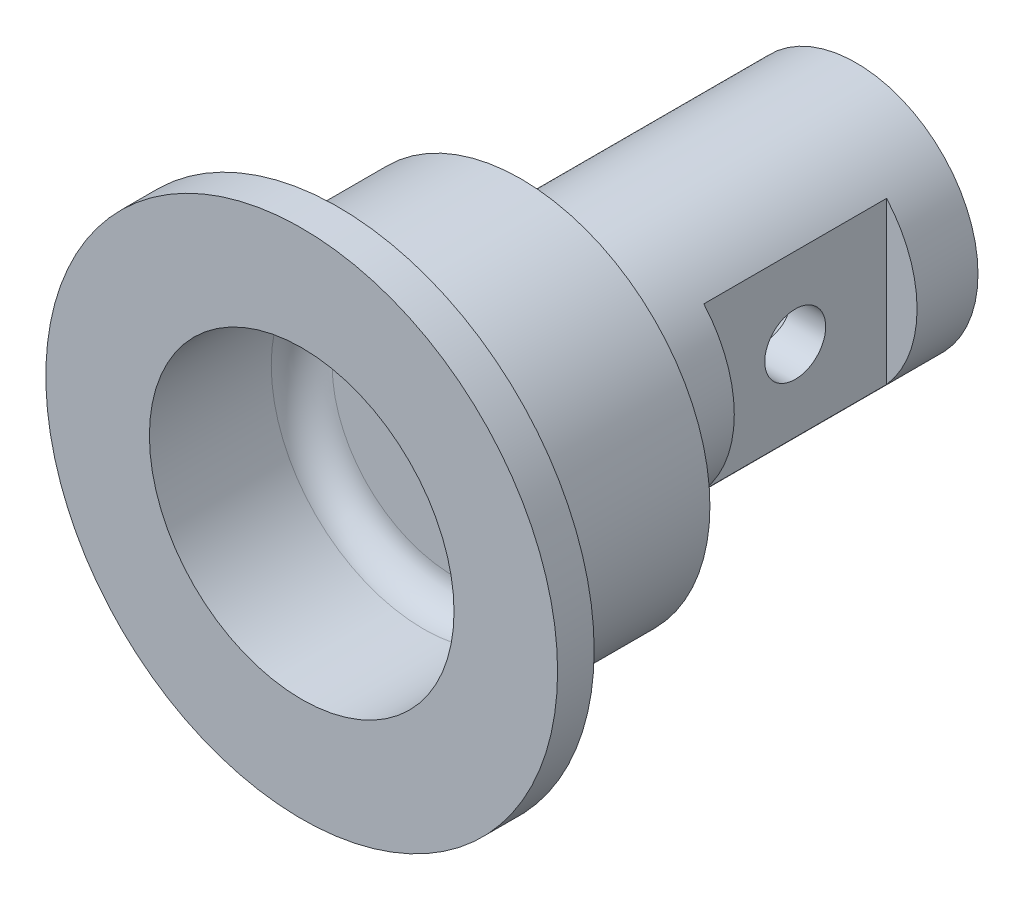
ISO-10303-21;
HEADER;
FILE_DESCRIPTION(('STEP AP214'),'2;1');
FILE_NAME('part.step','',(''),(''),'','','');
FILE_SCHEMA(('AUTOMOTIVE_DESIGN { 1 0 10303 214 1 1 1 1 }'));
ENDSEC;
DATA;
#1=APPLICATION_CONTEXT('core data for automotive mechanical design processes');
#2=APPLICATION_PROTOCOL_DEFINITION('international standard','automotive_design',2000,#1);
#3=PRODUCT_CONTEXT('',#1,'mechanical');
#4=PRODUCT('Part','Part','',(#3));
#5=PRODUCT_RELATED_PRODUCT_CATEGORY('part','',(#4));
#6=PRODUCT_DEFINITION_FORMATION('','',#4);
#7=PRODUCT_DEFINITION_CONTEXT('part definition',#1,'design');
#8=PRODUCT_DEFINITION('design','',#6,#7);
#9=PRODUCT_DEFINITION_SHAPE('','',#8);
#10=(LENGTH_UNIT() NAMED_UNIT(*) SI_UNIT(.MILLI.,.METRE.));
#11=(NAMED_UNIT(*) PLANE_ANGLE_UNIT() SI_UNIT($,.RADIAN.));
#12=(NAMED_UNIT(*) SI_UNIT($,.STERADIAN.) SOLID_ANGLE_UNIT());
#13=UNCERTAINTY_MEASURE_WITH_UNIT(LENGTH_MEASURE(1.E-05),#10,'distance_accuracy_value','');
#14=(GEOMETRIC_REPRESENTATION_CONTEXT(3) GLOBAL_UNCERTAINTY_ASSIGNED_CONTEXT((#13)) GLOBAL_UNIT_ASSIGNED_CONTEXT((#10,
#11,#12)) REPRESENTATION_CONTEXT('',''));
#15=CARTESIAN_POINT('',(0.,0.,0.));
#16=DIRECTION('',(0.,0.,1.));
#17=DIRECTION('',(1.,0.,0.));
#18=AXIS2_PLACEMENT_3D('',#15,#16,#17);
#19=CARTESIAN_POINT('',(0.,0.,3.67763366819807));
#20=DIRECTION('',(0.,0.,1.));
#21=DIRECTION('',(1.,0.,0.));
#22=AXIS2_PLACEMENT_3D('',#19,#20,#21);
#23=CYLINDRICAL_SURFACE('',#22,9.);
#24=CARTESIAN_POINT('',(0.,0.,-91.));
#25=DIRECTION('',(0.,0.,1.));
#26=DIRECTION('',(1.,0.,0.));
#27=AXIS2_PLACEMENT_3D('',#24,#25,#26);
#28=CIRCLE('',#27,8.99999999999999);
#29=CARTESIAN_POINT('',(8.99999999999999,0.,-91.));
#30=VERTEX_POINT('',#29);
#31=EDGE_CURVE('E233',#30,#30,#28,.T.);
#32=ORIENTED_EDGE('',*,*,#31,.F.);
#33=EDGE_LOOP('',(#32));
#34=FACE_BOUND('',#33,.T.);
#35=CARTESIAN_POINT('',(0.,0.,-25.));
#36=DIRECTION('',(0.,0.,1.));
#37=DIRECTION('',(1.,0.,0.));
#38=AXIS2_PLACEMENT_3D('',#35,#36,#37);
#39=CIRCLE('',#38,9.);
#40=CARTESIAN_POINT('',(9.,0.,-25.));
#41=VERTEX_POINT('',#40);
#42=EDGE_CURVE('E232',#41,#41,#39,.T.);
#43=ORIENTED_EDGE('',*,*,#42,.T.);
#44=EDGE_LOOP('',(#43));
#45=FACE_BOUND('',#44,.T.);
#46=CARTESIAN_POINT('',(9.,0.,-71.));
#47=CARTESIAN_POINT('',(9.00000035367435,0.129728650098871,-71.0000004034984));
#48=CARTESIAN_POINT('',(8.99718916475518,0.259452073794095,-70.9949457291585));
#49=CARTESIAN_POINT('',(8.98601661845686,0.517921555695226,-70.9747929956815));
#50=CARTESIAN_POINT('',(8.97765330942365,0.646667254114374,-70.9596914048975));
#51=CARTESIAN_POINT('',(8.955591631334,0.902114816809585,-70.9196443065761));
#52=CARTESIAN_POINT('',(8.94189463304534,1.02881719751598,-70.8947013282714));
#53=CARTESIAN_POINT('',(8.90950110249539,1.27935747075158,-70.8352693657243));
#54=CARTESIAN_POINT('',(8.89080251301057,1.40319416175913,-70.8007764532571));
#55=CARTESIAN_POINT('',(8.84894060668929,1.64664425181187,-70.7227988187132));
#56=CARTESIAN_POINT('',(8.82579612337894,1.76627303289197,-70.6793519723011));
#57=CARTESIAN_POINT('',(8.77551906926368,2.00118015325758,-70.5838168431952));
#58=CARTESIAN_POINT('',(8.74838499507351,2.11645683188321,-70.5317253019913));
#59=CARTESIAN_POINT('',(8.6618736377096,2.45478877397503,-70.3631884503319));
#60=CARTESIAN_POINT('',(8.59735346727595,2.67053417661057,-70.2344198818943));
#61=CARTESIAN_POINT('',(8.45507241221886,3.09271229088071,-69.9378076863466));
#62=CARTESIAN_POINT('',(8.37670278285858,3.29745415964199,-69.7678695156046));
#63=CARTESIAN_POINT('',(8.21711406392092,3.67715998948636,-69.3983538741864));
#64=CARTESIAN_POINT('',(8.13589216491853,3.85209353794295,-69.1987465168942));
#65=CARTESIAN_POINT('',(7.97009263226157,4.18516795747926,-68.7513058265881));
#66=CARTESIAN_POINT('',(7.88600912242672,4.33981028101034,-68.5006351634021));
#67=CARTESIAN_POINT('',(7.77258662819672,4.53792036965587,-68.1045411217027));
#68=CARTESIAN_POINT('',(7.73689861013124,4.59831134885593,-67.9691734216196));
#69=CARTESIAN_POINT('',(7.67113380801424,4.70719976108135,-67.692446845762));
#70=CARTESIAN_POINT('',(7.64105531823257,4.75570081097956,-67.5510898073064));
#71=CARTESIAN_POINT('',(7.57250099477047,4.86451848682887,-67.1799943165465));
#72=CARTESIAN_POINT('',(7.53922489494338,4.91545327804221,-66.9464097803243));
#73=CARTESIAN_POINT('',(7.49451395010562,4.98336969334309,-66.4724996130238));
#74=CARTESIAN_POINT('',(7.48305757595619,5.00038478617411,-66.2321808643583));
#75=CARTESIAN_POINT('',(7.48358103631205,4.99960164647186,-65.7513456479217));
#76=CARTESIAN_POINT('',(7.49558653424254,4.98176529219689,-65.5108292516151));
#77=CARTESIAN_POINT('',(7.54134329912877,4.91220969738461,-65.0368419240406));
#78=CARTESIAN_POINT('',(7.57510870603263,4.8604684245036,-64.8033756774211));
#79=CARTESIAN_POINT('',(7.65998850707494,4.72555331937599,-64.3491364552529));
#80=CARTESIAN_POINT('',(7.71110675816709,4.64237249870864,-64.1283663143898));
#81=CARTESIAN_POINT('',(7.82517266123028,4.447403175792,-63.7031833464194));
#82=CARTESIAN_POINT('',(7.88812493091397,4.33560350009452,-63.4987769490985));
#83=CARTESIAN_POINT('',(8.03034742050394,4.06693738507512,-63.0791797137506));
#84=CARTESIAN_POINT('',(8.11064361563464,3.90580419516377,-62.8670704959664));
#85=CARTESIAN_POINT('',(8.2717439652866,3.55190169354529,-62.4709010721211));
#86=CARTESIAN_POINT('',(8.3525484718906,3.35910741508491,-62.2868632247962));
#87=CARTESIAN_POINT('',(8.47255594770407,3.03820334696238,-62.0262203820365));
#88=CARTESIAN_POINT('',(8.51415799334354,2.91988181005322,-61.9384610971818));
#89=CARTESIAN_POINT('',(8.59416899062468,2.67521853140362,-61.773303132516));
#90=CARTESIAN_POINT('',(8.63257915962084,2.54887988004622,-61.6959004958319));
#91=CARTESIAN_POINT('',(8.70511911408219,2.28891079019195,-61.5521979144296));
#92=CARTESIAN_POINT('',(8.73925001402194,2.15528226330413,-61.4858950774127));
#93=CARTESIAN_POINT('',(8.80223607285831,1.88158110652943,-61.3651304371239));
#94=CARTESIAN_POINT('',(8.83109187375265,1.74150926341687,-61.31066719278));
#95=CARTESIAN_POINT('',(8.88080389711844,1.46611496312215,-61.2177299675468));
#96=CARTESIAN_POINT('',(8.90208189584858,1.33115857131801,-61.1783968460121));
#97=CARTESIAN_POINT('',(8.9387020465349,1.05765459084792,-61.1111154382259));
#98=CARTESIAN_POINT('',(8.95404497497796,0.919107474489844,-61.0831656626629));
#99=CARTESIAN_POINT('',(8.97833234249117,0.639688147055652,-61.0390736483573));
#100=CARTESIAN_POINT('',(8.98728120107926,0.49881761093925,-61.022923253825));
#101=CARTESIAN_POINT('',(8.99852157239254,0.215954097478498,-61.0026543866648));
#102=CARTESIAN_POINT('',(9.00081373995796,0.0739612319194,-60.9985347305341));
#103=CARTESIAN_POINT('',(8.99879540596083,-0.193661310485759,-61.0021687734577));
#104=CARTESIAN_POINT('',(8.99520578290284,-0.319316398566564,-61.0086261118927));
#105=CARTESIAN_POINT('',(8.98283315150498,-0.569568337701514,-61.0309580369905));
#106=CARTESIAN_POINT('',(8.9740485404227,-0.694164850128344,-61.0468355299366));
#107=CARTESIAN_POINT('',(8.95149651046085,-0.941327320488153,-61.087812709104));
#108=CARTESIAN_POINT('',(8.93773095073358,-1.06389401822774,-61.1129089544545));
#109=CARTESIAN_POINT('',(8.9055432099694,-1.30624674826634,-61.1720288858661));
#110=CARTESIAN_POINT('',(8.88711923415738,-1.42603168935625,-61.2060560129727));
#111=CARTESIAN_POINT('',(8.82561614200696,-1.77910695000251,-61.3207136092339));
#112=CARTESIAN_POINT('',(8.77619255116918,-2.00729552902005,-61.4141194967416));
#113=CARTESIAN_POINT('',(8.6645087493568,-2.444888008863,-61.6316601669243));
#114=CARTESIAN_POINT('',(8.6022451040581,-2.65428686245935,-61.7558031726298));
#115=CARTESIAN_POINT('',(8.46272453532917,-3.07172957903526,-62.0458219722926));
#116=CARTESIAN_POINT('',(8.38458363909743,-3.27740782973052,-62.2146808556353));
#117=CARTESIAN_POINT('',(8.2252061137152,-3.65908152653597,-62.5821867954545));
#118=CARTESIAN_POINT('',(8.14396615672223,-3.83504389654575,-62.7808665865338));
#119=CARTESIAN_POINT('',(7.97793731767647,-4.17023823002671,-63.2261230952558));
#120=CARTESIAN_POINT('',(7.89361512920964,-4.32600004905648,-63.475508481209));
#121=CARTESIAN_POINT('',(7.74146523733294,-4.59275891633598,-64.001689370523));
#122=CARTESIAN_POINT('',(7.67361425911822,-4.70381927827813,-64.2784454094521));
#123=CARTESIAN_POINT('',(7.57683809208936,-4.85777774830002,-64.7924339279546));
#124=CARTESIAN_POINT('',(7.5427474465653,-4.91005771973349,-65.0258825344073));
#125=CARTESIAN_POINT('',(7.49631291383466,-4.98067851749207,-65.4998932849409));
#126=CARTESIAN_POINT('',(7.48394730481337,-4.99905324495845,-65.7404480788372));
#127=CARTESIAN_POINT('',(7.48272923894069,-5.00087641660016,-66.2220434854711));
#128=CARTESIAN_POINT('',(7.49390605410458,-4.98428138030366,-66.4630843302881));
#129=CARTESIAN_POINT('',(7.5381922351137,-4.91703272116073,-66.9383360755629));
#130=CARTESIAN_POINT('',(7.57131560614076,-4.86635734965788,-67.1725425149428));
#131=CARTESIAN_POINT('',(7.65501053053173,-4.73359019709714,-67.6276373406161));
#132=CARTESIAN_POINT('',(7.70552932370029,-4.65159333262122,-67.8485636525452));
#133=CARTESIAN_POINT('',(7.81855933555384,-4.45898685237774,-68.2742180217571));
#134=CARTESIAN_POINT('',(7.88107517147513,-4.34836621460618,-68.4789397995025));
#135=CARTESIAN_POINT('',(8.02246926398217,-4.08239378948777,-68.8991183375095));
#136=CARTESIAN_POINT('',(8.10239358916594,-3.92281334521187,-69.1115438786473));
#137=CARTESIAN_POINT('',(8.26301218742008,-3.57208449742688,-69.508615204111));
#138=CARTESIAN_POINT('',(8.34370703244943,-3.38091059241463,-69.6932383149828));
#139=CARTESIAN_POINT('',(8.46388232404898,-3.06226198232623,-69.9552664708034));
#140=CARTESIAN_POINT('',(8.50565265713108,-2.94454455618599,-70.0436910628917));
#141=CARTESIAN_POINT('',(8.58607842088329,-2.70104919272108,-70.2102335331473));
#142=CARTESIAN_POINT('',(8.62473502968511,-2.57527433671188,-70.2883553167594));
#143=CARTESIAN_POINT('',(8.69784009103003,-2.3163911453281,-70.4335486508301));
#144=CARTESIAN_POINT('',(8.73228991401566,-2.18328521880679,-70.5006238024406));
#145=CARTESIAN_POINT('',(8.79598351699735,-1.91056755470906,-70.6229922280432));
#146=CARTESIAN_POINT('',(8.82522802746501,-1.77095673345214,-70.6782871553919));
#147=CARTESIAN_POINT('',(8.87524400995768,-1.49912870468088,-70.7719363734518));
#148=CARTESIAN_POINT('',(8.89654158296884,-1.36737917982355,-70.8113683212244));
#149=CARTESIAN_POINT('',(8.93349970483441,-1.10033791857094,-70.8793680968185));
#150=CARTESIAN_POINT('',(8.94916100560194,-0.965046657250132,-70.9079373738153));
#151=CARTESIAN_POINT('',(8.97439622187977,-0.692088324433116,-70.9538020096181));
#152=CARTESIAN_POINT('',(8.98397387690142,-0.554422765939954,-70.9711042942135));
#153=CARTESIAN_POINT('',(8.99677541735903,-0.277836098507378,-70.9942027849947));
#154=CARTESIAN_POINT('',(8.9999996212811,-0.138915052853806,-70.9999995679289));
#155=CARTESIAN_POINT('',(9.,0.,-71.));
#156=B_SPLINE_CURVE_WITH_KNOTS('',3,(#46,#47,#48,#49,#50,#51,#52,#53,#54,#55,#56,#57,#58,#59,
#60,#61,#62,#63,#64,#65,#66,#67,#68,#69,#70,#71,#72,#73,#74,#75,#76,#77,#78,#79,#80,#81,#82,#83,
#84,#85,#86,#87,#88,#89,#90,#91,#92,#93,#94,#95,#96,#97,#98,#99,#100,#101,#102,#103,#104,#105,
#106,#107,#108,#109,#110,#111,#112,#113,#114,#115,#116,#117,#118,#119,#120,#121,#122,#123,#124,
#125,#126,#127,#128,#129,#130,#131,#132,#133,#134,#135,#136,#137,#138,#139,#140,#141,#142,#143,
#144,#145,#146,#147,#148,#149,#150,#151,#152,#153,#154,#155),.UNSPECIFIED.,.T.,.F.,(4,2,2,2,2,2,
2,2,2,2,2,2,2,2,2,2,2,2,2,2,2,2,2,2,2,2,2,2,2,2,2,2,2,2,2,2,2,2,2,2,2,2,2,2,2,2,2,2,2,2,2,2,2,2,
4),(0.,0.389049038673795,0.778234906423187,1.1673208186441,1.5565670140197,1.94419928087583,
2.33197799415704,3.10694003691382,3.93579164360749,4.76548390659347,5.67926108729747,
6.13607645300721,6.59275268424476,7.31346839098545,8.03347261109578,8.75426483810458,
9.47552592073739,10.1969474205329,10.9186510103256,11.7500289468904,12.5820656531715,
13.0407937204138,13.4993460219527,13.9577786509197,14.4161554498582,14.8420733324614,
15.2679354732486,15.6935029768355,16.1190286145523,16.4961868590171,16.8734615239822,
17.2505955151925,17.6278750290088,18.3788772686743,19.1300806397395,19.9587345054797,
20.7883047338675,21.7014293455294,22.613256047122,23.3350470842321,24.0561160257529,
24.778082054147,25.5005092490548,26.2207643506841,26.9412972109114,27.7704094124313,
28.6001941523199,29.05881328468,29.5172580673313,29.9755531019595,30.4337837723653,
30.8507153459596,31.2675912777015,31.684210714444,32.100809266336),.UNSPECIFIED.);
#157=CARTESIAN_POINT('',(9.,0.,-71.));
#158=VERTEX_POINT('',#157);
#159=EDGE_CURVE('E80',#158,#158,#156,.T.);
#160=ORIENTED_EDGE('',*,*,#159,.T.);
#161=EDGE_LOOP('',(#160));
#162=FACE_BOUND('',#161,.T.);
#163=CARTESIAN_POINT('',(-9.,0.,-61.));
#164=CARTESIAN_POINT('',(-9.00000035367435,-0.129728650098871,-60.9999995965016));
#165=CARTESIAN_POINT('',(-8.99718916475518,-0.259452073794094,-61.0050542708415));
#166=CARTESIAN_POINT('',(-8.98601661845686,-0.517921555695226,-61.0252070043185));
#167=CARTESIAN_POINT('',(-8.97765330942365,-0.646667254114373,-61.0403085951025));
#168=CARTESIAN_POINT('',(-8.955591631334,-0.902114816809584,-61.0803556934239));
#169=CARTESIAN_POINT('',(-8.94189463304534,-1.02881719751598,-61.1052986717286));
#170=CARTESIAN_POINT('',(-8.90950110249538,-1.27935747075158,-61.1647306342757));
#171=CARTESIAN_POINT('',(-8.89080251301057,-1.40319416175913,-61.199223546743));
#172=CARTESIAN_POINT('',(-8.84894060668929,-1.64664425181187,-61.2772011812869));
#173=CARTESIAN_POINT('',(-8.82579612337894,-1.76627303289197,-61.3206480276989));
#174=CARTESIAN_POINT('',(-8.77551906926368,-2.00118015325758,-61.4161831568048));
#175=CARTESIAN_POINT('',(-8.74838499507351,-2.1164568318832,-61.4682746980087));
#176=CARTESIAN_POINT('',(-8.6618736377096,-2.45478877397503,-61.6368115496681));
#177=CARTESIAN_POINT('',(-8.59735346727595,-2.67053417661057,-61.7655801181058));
#178=CARTESIAN_POINT('',(-8.45507241221886,-3.09271229088071,-62.0621923136534));
#179=CARTESIAN_POINT('',(-8.37670278285858,-3.29745415964199,-62.2321304843954));
#180=CARTESIAN_POINT('',(-8.21711406392092,-3.67715998948636,-62.6016461258136));
#181=CARTESIAN_POINT('',(-8.13589216491853,-3.85209353794295,-62.8012534831058));
#182=CARTESIAN_POINT('',(-7.97009263226157,-4.18516795747926,-63.2486941734119));
#183=CARTESIAN_POINT('',(-7.88600912242673,-4.33981028101033,-63.4993648365979));
#184=CARTESIAN_POINT('',(-7.77258662819672,-4.53792036965587,-63.8954588782973));
#185=CARTESIAN_POINT('',(-7.73689861013124,-4.59831134885592,-64.0308265783804));
#186=CARTESIAN_POINT('',(-7.67113380801424,-4.70719976108134,-64.307553154238));
#187=CARTESIAN_POINT('',(-7.64105531823258,-4.75570081097956,-64.4489101926936));
#188=CARTESIAN_POINT('',(-7.57250099477048,-4.86451848682886,-64.8200056834535));
#189=CARTESIAN_POINT('',(-7.53922489494338,-4.9154532780422,-65.0535902196757));
#190=CARTESIAN_POINT('',(-7.49451395010562,-4.98336969334309,-65.5275003869762));
#191=CARTESIAN_POINT('',(-7.48305757595619,-5.00038478617411,-65.7678191356418));
#192=CARTESIAN_POINT('',(-7.48358103631205,-4.99960164647186,-66.2486543520783));
#193=CARTESIAN_POINT('',(-7.49558653424254,-4.98176529219689,-66.4891707483849));
#194=CARTESIAN_POINT('',(-7.54134329912877,-4.91220969738461,-66.9631580759594));
#195=CARTESIAN_POINT('',(-7.57510870603263,-4.8604684245036,-67.196624322579));
#196=CARTESIAN_POINT('',(-7.65998850707494,-4.72555331937599,-67.6508635447471));
#197=CARTESIAN_POINT('',(-7.71110675816709,-4.64237249870864,-67.8716336856102));
#198=CARTESIAN_POINT('',(-7.82517266123028,-4.447403175792,-68.2968166535806));
#199=CARTESIAN_POINT('',(-7.88812493091397,-4.33560350009452,-68.5012230509015));
#200=CARTESIAN_POINT('',(-8.03034742050394,-4.06693738507512,-68.9208202862494));
#201=CARTESIAN_POINT('',(-8.11064361563464,-3.90580419516378,-69.1329295040336));
#202=CARTESIAN_POINT('',(-8.2717439652866,-3.55190169354529,-69.5290989278789));
#203=CARTESIAN_POINT('',(-8.3525484718906,-3.35910741508491,-69.7131367752038));
#204=CARTESIAN_POINT('',(-8.47255594770407,-3.03820334696238,-69.9737796179635));
#205=CARTESIAN_POINT('',(-8.51415799334354,-2.91988181005324,-70.0615389028183));
#206=CARTESIAN_POINT('',(-8.59416899062467,-2.67521853140363,-70.226696867484));
#207=CARTESIAN_POINT('',(-8.63257915962083,-2.54887988004623,-70.3040995041681));
#208=CARTESIAN_POINT('',(-8.70511911408218,-2.28891079019195,-70.4478020855704));
#209=CARTESIAN_POINT('',(-8.73925001402194,-2.15528226330414,-70.5141049225873));
#210=CARTESIAN_POINT('',(-8.80223607285831,-1.88158110652943,-70.6348695628761));
#211=CARTESIAN_POINT('',(-8.83109187375265,-1.74150926341688,-70.68933280722));
#212=CARTESIAN_POINT('',(-8.88080389711844,-1.46611496312215,-70.7822700324532));
#213=CARTESIAN_POINT('',(-8.90208189584859,-1.33115857131801,-70.8216031539879));
#214=CARTESIAN_POINT('',(-8.9387020465349,-1.05765459084792,-70.8888845617741));
#215=CARTESIAN_POINT('',(-8.95404497497797,-0.919107474489841,-70.9168343373371));
#216=CARTESIAN_POINT('',(-8.97833234249117,-0.639688147055648,-70.9609263516428));
#217=CARTESIAN_POINT('',(-8.98728120107926,-0.498817610939246,-70.9770767461751));
#218=CARTESIAN_POINT('',(-8.99852157239254,-0.215954097478492,-70.9973456133352));
#219=CARTESIAN_POINT('',(-9.00081373995796,-0.0739612319193939,-71.0014652694659));
#220=CARTESIAN_POINT('',(-8.99879540596083,0.193661310485765,-70.9978312265424));
#221=CARTESIAN_POINT('',(-8.99520578290284,0.31931639856657,-70.9913738881073));
#222=CARTESIAN_POINT('',(-8.98283315150498,0.56956833770152,-70.9690419630095));
#223=CARTESIAN_POINT('',(-8.9740485404227,0.694164850128351,-70.9531644700634));
#224=CARTESIAN_POINT('',(-8.95149651046085,0.941327320488158,-70.912187290896));
#225=CARTESIAN_POINT('',(-8.93773095073358,1.06389401822775,-70.8870910455455));
#226=CARTESIAN_POINT('',(-8.9055432099694,1.30624674826635,-70.8279711141339));
#227=CARTESIAN_POINT('',(-8.88711923415738,1.42603168935625,-70.7939439870273));
#228=CARTESIAN_POINT('',(-8.82561614200696,1.77910695000251,-70.6792863907662));
#229=CARTESIAN_POINT('',(-8.77619255116918,2.00729552902005,-70.5858805032585));
#230=CARTESIAN_POINT('',(-8.6645087493568,2.44488800886301,-70.3683398330757));
#231=CARTESIAN_POINT('',(-8.6022451040581,2.65428686245935,-70.2441968273702));
#232=CARTESIAN_POINT('',(-8.46272453532917,3.07172957903526,-69.9541780277074));
#233=CARTESIAN_POINT('',(-8.38458363909743,3.27740782973052,-69.7853191443647));
#234=CARTESIAN_POINT('',(-8.2252061137152,3.65908152653597,-69.4178132045455));
#235=CARTESIAN_POINT('',(-8.14396615672223,3.83504389654575,-69.2191334134662));
#236=CARTESIAN_POINT('',(-7.97793731767647,4.17023823002672,-68.7738769047442));
#237=CARTESIAN_POINT('',(-7.89361512920964,4.32600004905649,-68.5244915187911));
#238=CARTESIAN_POINT('',(-7.74146523733294,4.59275891633598,-67.998310629477));
#239=CARTESIAN_POINT('',(-7.67361425911822,4.70381927827813,-67.7215545905479));
#240=CARTESIAN_POINT('',(-7.57683809208936,4.85777774830002,-67.2075660720454));
#241=CARTESIAN_POINT('',(-7.5427474465653,4.91005771973349,-66.9741174655927));
#242=CARTESIAN_POINT('',(-7.49631291383466,4.98067851749207,-66.5001067150591));
#243=CARTESIAN_POINT('',(-7.48394730481337,4.99905324495845,-66.2595519211628));
#244=CARTESIAN_POINT('',(-7.48272923894069,5.00087641660016,-65.777956514529));
#245=CARTESIAN_POINT('',(-7.49390605410458,4.98428138030366,-65.5369156697119));
#246=CARTESIAN_POINT('',(-7.5381922351137,4.91703272116073,-65.0616639244371));
#247=CARTESIAN_POINT('',(-7.57131560614075,4.86635734965788,-64.8274574850572));
#248=CARTESIAN_POINT('',(-7.65501053053173,4.73359019709714,-64.3723626593839));
#249=CARTESIAN_POINT('',(-7.70552932370029,4.65159333262122,-64.1514363474548));
#250=CARTESIAN_POINT('',(-7.81855933555384,4.45898685237774,-63.7257819782429));
#251=CARTESIAN_POINT('',(-7.88107517147513,4.34836621460618,-63.5210602004975));
#252=CARTESIAN_POINT('',(-8.02246926398217,4.08239378948777,-63.1008816624905));
#253=CARTESIAN_POINT('',(-8.10239358916594,3.92281334521187,-62.8884561213527));
#254=CARTESIAN_POINT('',(-8.26301218742008,3.57208449742688,-62.4913847958891));
#255=CARTESIAN_POINT('',(-8.34370703244943,3.38091059241463,-62.3067616850172));
#256=CARTESIAN_POINT('',(-8.46388232404898,3.06226198232623,-62.0447335291966));
#257=CARTESIAN_POINT('',(-8.50565265713109,2.94454455618599,-61.9563089371083));
#258=CARTESIAN_POINT('',(-8.5860784208833,2.70104919272108,-61.7897664668527));
#259=CARTESIAN_POINT('',(-8.62473502968511,2.57527433671188,-61.7116446832406));
#260=CARTESIAN_POINT('',(-8.69784009103003,2.31639114532809,-61.5664513491699));
#261=CARTESIAN_POINT('',(-8.73228991401566,2.18328521880678,-61.4993761975594));
#262=CARTESIAN_POINT('',(-8.79598351699735,1.91056755470905,-61.3770077719568));
#263=CARTESIAN_POINT('',(-8.82522802746501,1.77095673345214,-61.3217128446081));
#264=CARTESIAN_POINT('',(-8.87524400995768,1.49912870468087,-61.2280636265482));
#265=CARTESIAN_POINT('',(-8.89654158296884,1.36737917982355,-61.1886316787756));
#266=CARTESIAN_POINT('',(-8.93349970483441,1.10033791857094,-61.1206319031815));
#267=CARTESIAN_POINT('',(-8.94916100560194,0.965046657250129,-61.0920626261847));
#268=CARTESIAN_POINT('',(-8.97439622187977,0.692088324433115,-61.046197990382));
#269=CARTESIAN_POINT('',(-8.98397387690142,0.554422765939957,-61.0288957057865));
#270=CARTESIAN_POINT('',(-8.99677541735903,0.277836098507382,-61.0057972150053));
#271=CARTESIAN_POINT('',(-8.9999996212811,0.138915052853808,-61.0000004320711));
#272=CARTESIAN_POINT('',(-9.,0.,-61.));
#273=B_SPLINE_CURVE_WITH_KNOTS('',3,(#163,#164,#165,#166,#167,#168,#169,#170,#171,#172,#173,
#174,#175,#176,#177,#178,#179,#180,#181,#182,#183,#184,#185,#186,#187,#188,#189,#190,#191,#192,
#193,#194,#195,#196,#197,#198,#199,#200,#201,#202,#203,#204,#205,#206,#207,#208,#209,#210,#211,
#212,#213,#214,#215,#216,#217,#218,#219,#220,#221,#222,#223,#224,#225,#226,#227,#228,#229,#230,
#231,#232,#233,#234,#235,#236,#237,#238,#239,#240,#241,#242,#243,#244,#245,#246,#247,#248,#249,
#250,#251,#252,#253,#254,#255,#256,#257,#258,#259,#260,#261,#262,#263,#264,#265,#266,#267,#268,
#269,#270,#271,#272),.UNSPECIFIED.,.T.,.F.,(4,2,2,2,2,2,2,2,2,2,2,2,2,2,2,2,2,2,2,2,2,2,2,2,2,2,
2,2,2,2,2,2,2,2,2,2,2,2,2,2,2,2,2,2,2,2,2,2,2,2,2,2,2,2,4),(0.,0.389049038673794,
0.778234906423187,1.16732081864409,1.5565670140197,1.94419928087582,2.33197799415703,
3.10694003691382,3.93579164360748,4.76548390659346,5.67926108729746,6.1360764530072,
6.59275268424476,7.31346839098542,8.03347261109578,8.75426483810458,9.47552592073739,
10.1969474205329,10.9186510103256,11.7500289468904,12.5820656531715,13.0407937204138,
13.4993460219527,13.9577786509197,14.4161554498582,14.8420733324614,15.2679354732486,
15.6935029768355,16.1190286145523,16.4961868590171,16.8734615239822,17.2505955151925,
17.6278750290088,18.3788772686743,19.1300806397395,19.9587345054797,20.7883047338674,
21.7014293455294,22.613256047122,23.3350470842321,24.0561160257529,24.778082054147,
25.5005092490548,26.2207643506841,26.9412972109114,27.7704094124313,28.6001941523198,
29.05881328468,29.5172580673313,29.9755531019595,30.4337837723653,30.8507153459596,
31.2675912777015,31.684210714444,32.100809266336),.UNSPECIFIED.);
#274=CARTESIAN_POINT('',(-9.,0.,-61.));
#275=VERTEX_POINT('',#274);
#276=EDGE_CURVE('E88',#275,#275,#273,.T.);
#277=ORIENTED_EDGE('',*,*,#276,.F.);
#278=EDGE_LOOP('',(#277));
#279=FACE_BOUND('',#278,.T.);
#280=ADVANCED_FACE('F32',(#34,#45,#162,#279),#23,.F.);
#281=CARTESIAN_POINT('',(0.,0.,3.67763366819807));
#282=DIRECTION('',(0.,0.,1.));
#283=DIRECTION('',(1.,0.,0.));
#284=AXIS2_PLACEMENT_3D('',#281,#282,#283);
#285=CYLINDRICAL_SURFACE('',#284,20.);
#286=CARTESIAN_POINT('',(0.,0.,-51.));
#287=DIRECTION('',(0.,0.,1.));
#288=DIRECTION('',(1.,0.,0.));
#289=AXIS2_PLACEMENT_3D('',#286,#287,#288);
#290=CIRCLE('',#289,20.);
#291=CARTESIAN_POINT('',(-15.,13.2287565553229,-51.));
#292=VERTEX_POINT('',#291);
#293=CARTESIAN_POINT('',(-15.,-13.228756555323,-51.));
#294=VERTEX_POINT('',#293);
#295=EDGE_CURVE('E77',#292,#294,#290,.T.);
#296=ORIENTED_EDGE('',*,*,#295,.T.);
#297=DIRECTION('',(0.,0.,1.));
#298=VECTOR('',#297,1.);
#299=CARTESIAN_POINT('',(-15.,-13.2287565553229,3.67763366819807));
#300=LINE('',#299,#298);
#301=CARTESIAN_POINT('',(-15.,-13.2287565553229,-81.));
#302=VERTEX_POINT('',#301);
#303=EDGE_CURVE('E83',#302,#294,#300,.T.);
#304=ORIENTED_EDGE('',*,*,#303,.F.);
#305=CARTESIAN_POINT('',(0.,0.,-81.));
#306=DIRECTION('',(0.,0.,-1.));
#307=DIRECTION('',(-1.,0.,0.));
#308=AXIS2_PLACEMENT_3D('',#305,#306,#307);
#309=CIRCLE('',#308,20.);
#310=CARTESIAN_POINT('',(-15.,13.228756555323,-81.));
#311=VERTEX_POINT('',#310);
#312=EDGE_CURVE('E87',#302,#311,#309,.T.);
#313=ORIENTED_EDGE('',*,*,#312,.T.);
#314=DIRECTION('',(0.,0.,1.));
#315=VECTOR('',#314,1.);
#316=CARTESIAN_POINT('',(-15.,13.2287565553229,3.67763366819807));
#317=LINE('',#316,#315);
#318=EDGE_CURVE('E92',#311,#292,#317,.T.);
#319=ORIENTED_EDGE('',*,*,#318,.T.);
#320=EDGE_LOOP('',(#296,#304,#313,#319));
#321=FACE_BOUND('',#320,.T.);
#322=CARTESIAN_POINT('',(0.,0.,-41.));
#323=DIRECTION('',(0.,0.,-1.));
#324=DIRECTION('',(-1.,0.,0.));
#325=AXIS2_PLACEMENT_3D('',#322,#323,#324);
#326=CIRCLE('',#325,20.);
#327=CARTESIAN_POINT('',(-20.,0.,-41.));
#328=VERTEX_POINT('',#327);
#329=EDGE_CURVE('E194',#328,#328,#326,.T.);
#330=ORIENTED_EDGE('',*,*,#329,.T.);
#331=EDGE_LOOP('',(#330));
#332=FACE_BOUND('',#331,.T.);
#333=CARTESIAN_POINT('',(0.,0.,-91.));
#334=DIRECTION('',(0.,0.,1.));
#335=DIRECTION('',(1.,0.,0.));
#336=AXIS2_PLACEMENT_3D('',#333,#334,#335);
#337=CIRCLE('',#336,20.);
#338=CARTESIAN_POINT('',(20.,0.,-91.));
#339=VERTEX_POINT('',#338);
#340=EDGE_CURVE('E219',#339,#339,#337,.T.);
#341=ORIENTED_EDGE('',*,*,#340,.T.);
#342=EDGE_LOOP('',(#341));
#343=FACE_BOUND('',#342,.T.);
#344=CARTESIAN_POINT('',(0.,0.,-51.));
#345=DIRECTION('',(0.,0.,-1.));
#346=DIRECTION('',(-1.,0.,0.));
#347=AXIS2_PLACEMENT_3D('',#344,#345,#346);
#348=CIRCLE('',#347,20.);
#349=CARTESIAN_POINT('',(15.,13.228756555323,-51.));
#350=VERTEX_POINT('',#349);
#351=CARTESIAN_POINT('',(15.,-13.2287565553229,-51.));
#352=VERTEX_POINT('',#351);
#353=EDGE_CURVE('E248',#350,#352,#348,.T.);
#354=ORIENTED_EDGE('',*,*,#353,.F.);
#355=DIRECTION('',(0.,0.,1.));
#356=VECTOR('',#355,1.);
#357=CARTESIAN_POINT('',(15.,13.2287565553229,3.67763366819807));
#358=LINE('',#357,#356);
#359=CARTESIAN_POINT('',(15.,13.2287565553229,-81.));
#360=VERTEX_POINT('',#359);
#361=EDGE_CURVE('E250',#360,#350,#358,.T.);
#362=ORIENTED_EDGE('',*,*,#361,.F.);
#363=CARTESIAN_POINT('',(0.,0.,-81.));
#364=DIRECTION('',(0.,0.,1.));
#365=DIRECTION('',(1.,0.,0.));
#366=AXIS2_PLACEMENT_3D('',#363,#364,#365);
#367=CIRCLE('',#366,20.);
#368=CARTESIAN_POINT('',(15.,-13.228756555323,-81.));
#369=VERTEX_POINT('',#368);
#370=EDGE_CURVE('E252',#369,#360,#367,.T.);
#371=ORIENTED_EDGE('',*,*,#370,.F.);
#372=DIRECTION('',(0.,0.,1.));
#373=VECTOR('',#372,1.);
#374=CARTESIAN_POINT('',(15.,-13.2287565553229,3.67763366819807));
#375=LINE('',#374,#373);
#376=EDGE_CURVE('E101',#369,#352,#375,.T.);
#377=ORIENTED_EDGE('',*,*,#376,.T.);
#378=EDGE_LOOP('',(#354,#362,#371,#377));
#379=FACE_BOUND('',#378,.T.);
#380=ADVANCED_FACE('F90',(#321,#332,#343,#379),#285,.T.);
#381=CARTESIAN_POINT('',(0.,0.,3.67763366819807));
#382=DIRECTION('',(0.,0.,1.));
#383=DIRECTION('',(1.,0.,0.));
#384=AXIS2_PLACEMENT_3D('',#381,#382,#383);
#385=CYLINDRICAL_SURFACE('',#384,25.);
#386=CARTESIAN_POINT('',(0.,0.,-20.));
#387=DIRECTION('',(0.,0.,1.));
#388=DIRECTION('',(1.,0.,0.));
#389=AXIS2_PLACEMENT_3D('',#386,#387,#388);
#390=CIRCLE('',#389,25.);
#391=CARTESIAN_POINT('',(25.,0.,-20.));
#392=VERTEX_POINT('',#391);
#393=EDGE_CURVE('E198',#392,#392,#390,.F.);
#394=ORIENTED_EDGE('',*,*,#393,.T.);
#395=EDGE_LOOP('',(#394));
#396=FACE_BOUND('',#395,.T.);
#397=CARTESIAN_POINT('',(0.,0.,0.));
#398=DIRECTION('',(0.,0.,1.));
#399=DIRECTION('',(1.,0.,0.));
#400=AXIS2_PLACEMENT_3D('',#397,#398,#399);
#401=CIRCLE('',#400,25.);
#402=CARTESIAN_POINT('',(25.,0.,0.));
#403=VERTEX_POINT('',#402);
#404=EDGE_CURVE('E216',#403,#403,#401,.T.);
#405=ORIENTED_EDGE('',*,*,#404,.T.);
#406=EDGE_LOOP('',(#405));
#407=FACE_BOUND('',#406,.T.);
#408=ADVANCED_FACE('F145',(#396,#407),#385,.F.);
#409=CARTESIAN_POINT('',(25.,0.,0.));
#410=DIRECTION('',(0.,0.,1.));
#411=DIRECTION('',(1.,0.,0.));
#412=AXIS2_PLACEMENT_3D('',#409,#410,#411);
#413=PLANE('',#412);
#414=CARTESIAN_POINT('',(0.,0.,0.));
#415=DIRECTION('',(0.,0.,1.));
#416=DIRECTION('',(1.,0.,0.));
#417=AXIS2_PLACEMENT_3D('',#414,#415,#416);
#418=CIRCLE('',#417,42.);
#419=CARTESIAN_POINT('',(42.,0.,0.));
#420=VERTEX_POINT('',#419);
#421=EDGE_CURVE('E212',#420,#420,#418,.T.);
#422=ORIENTED_EDGE('',*,*,#421,.T.);
#423=EDGE_LOOP('',(#422));
#424=FACE_BOUND('',#423,.T.);
#425=ORIENTED_EDGE('',*,*,#404,.F.);
#426=EDGE_LOOP('',(#425));
#427=FACE_BOUND('',#426,.T.);
#428=ADVANCED_FACE('F172',(#424,#427),#413,.T.);
#429=CARTESIAN_POINT('',(0.,0.,3.67763366819807));
#430=DIRECTION('',(0.,0.,1.));
#431=DIRECTION('',(1.,0.,0.));
#432=AXIS2_PLACEMENT_3D('',#429,#430,#431);
#433=CYLINDRICAL_SURFACE('',#432,42.);
#434=CARTESIAN_POINT('',(0.,0.,-6.));
#435=DIRECTION('',(0.,0.,1.));
#436=DIRECTION('',(1.,0.,0.));
#437=AXIS2_PLACEMENT_3D('',#434,#435,#436);
#438=CIRCLE('',#437,42.);
#439=CARTESIAN_POINT('',(42.,0.,-6.));
#440=VERTEX_POINT('',#439);
#441=EDGE_CURVE('E211',#440,#440,#438,.T.);
#442=ORIENTED_EDGE('',*,*,#441,.T.);
#443=EDGE_LOOP('',(#442));
#444=FACE_BOUND('',#443,.T.);
#445=ORIENTED_EDGE('',*,*,#421,.F.);
#446=EDGE_LOOP('',(#445));
#447=FACE_BOUND('',#446,.T.);
#448=ADVANCED_FACE('F168',(#444,#447),#433,.T.);
#449=CARTESIAN_POINT('',(42.,0.,-6.));
#450=DIRECTION('',(0.,0.,-1.));
#451=DIRECTION('',(-1.,0.,0.));
#452=AXIS2_PLACEMENT_3D('',#449,#450,#451);
#453=PLANE('',#452);
#454=CARTESIAN_POINT('',(0.,0.,-6.));
#455=DIRECTION('',(0.,0.,-1.));
#456=DIRECTION('',(-1.,0.,0.));
#457=AXIS2_PLACEMENT_3D('',#454,#455,#456);
#458=CIRCLE('',#457,36.);
#459=CARTESIAN_POINT('',(-36.,0.,-6.));
#460=VERTEX_POINT('',#459);
#461=EDGE_CURVE('E40',#460,#460,#458,.F.);
#462=ORIENTED_EDGE('',*,*,#461,.T.);
#463=EDGE_LOOP('',(#462));
#464=FACE_BOUND('',#463,.T.);
#465=ORIENTED_EDGE('',*,*,#441,.F.);
#466=EDGE_LOOP('',(#465));
#467=FACE_BOUND('',#466,.T.);
#468=ADVANCED_FACE('F164',(#464,#467),#453,.T.);
#469=CARTESIAN_POINT('',(0.,0.,3.67763366819807));
#470=DIRECTION('',(0.,0.,1.));
#471=DIRECTION('',(1.,0.,0.));
#472=AXIS2_PLACEMENT_3D('',#469,#470,#471);
#473=CYLINDRICAL_SURFACE('',#472,31.);
#474=CARTESIAN_POINT('',(0.,0.,-11.));
#475=DIRECTION('',(0.,0.,-1.));
#476=DIRECTION('',(-1.,0.,0.));
#477=AXIS2_PLACEMENT_3D('',#474,#475,#476);
#478=CIRCLE('',#477,31.);
#479=CARTESIAN_POINT('',(-31.,0.,-11.));
#480=VERTEX_POINT('',#479);
#481=EDGE_CURVE('E11',#480,#480,#478,.T.);
#482=ORIENTED_EDGE('',*,*,#481,.T.);
#483=EDGE_LOOP('',(#482));
#484=FACE_BOUND('',#483,.T.);
#485=CARTESIAN_POINT('',(0.,0.,-36.));
#486=DIRECTION('',(0.,0.,1.));
#487=DIRECTION('',(1.,0.,0.));
#488=AXIS2_PLACEMENT_3D('',#485,#486,#487);
#489=CIRCLE('',#488,31.);
#490=CARTESIAN_POINT('',(31.,0.,-36.));
#491=VERTEX_POINT('',#490);
#492=EDGE_CURVE('E213',#491,#491,#489,.T.);
#493=ORIENTED_EDGE('',*,*,#492,.T.);
#494=EDGE_LOOP('',(#493));
#495=FACE_BOUND('',#494,.T.);
#496=ADVANCED_FACE('F160',(#484,#495),#473,.T.);
#497=CARTESIAN_POINT('',(31.,0.,-36.));
#498=DIRECTION('',(0.,0.,-1.));
#499=DIRECTION('',(-1.,0.,0.));
#500=AXIS2_PLACEMENT_3D('',#497,#498,#499);
#501=PLANE('',#500);
#502=CARTESIAN_POINT('',(0.,0.,-36.));
#503=DIRECTION('',(0.,0.,-1.));
#504=DIRECTION('',(-1.,0.,0.));
#505=AXIS2_PLACEMENT_3D('',#502,#503,#504);
#506=CIRCLE('',#505,25.);
#507=CARTESIAN_POINT('',(-25.,0.,-36.));
#508=VERTEX_POINT('',#507);
#509=EDGE_CURVE('E197',#508,#508,#506,.F.);
#510=ORIENTED_EDGE('',*,*,#509,.T.);
#511=EDGE_LOOP('',(#510));
#512=FACE_BOUND('',#511,.T.);
#513=ORIENTED_EDGE('',*,*,#492,.F.);
#514=EDGE_LOOP('',(#513));
#515=FACE_BOUND('',#514,.T.);
#516=ADVANCED_FACE('F155',(#512,#515),#501,.T.);
#517=CARTESIAN_POINT('',(20.,0.,-91.));
#518=DIRECTION('',(0.,0.,-1.));
#519=DIRECTION('',(-1.,0.,0.));
#520=AXIS2_PLACEMENT_3D('',#517,#518,#519);
#521=PLANE('',#520);
#522=ORIENTED_EDGE('',*,*,#31,.T.);
#523=EDGE_LOOP('',(#522));
#524=FACE_BOUND('',#523,.T.);
#525=ORIENTED_EDGE('',*,*,#340,.F.);
#526=EDGE_LOOP('',(#525));
#527=FACE_BOUND('',#526,.T.);
#528=ADVANCED_FACE('F153',(#524,#527),#521,.T.);
#529=CARTESIAN_POINT('',(9.,0.,-25.));
#530=DIRECTION('',(0.,0.,1.));
#531=DIRECTION('',(1.,0.,0.));
#532=AXIS2_PLACEMENT_3D('',#529,#530,#531);
#533=PLANE('',#532);
#534=CARTESIAN_POINT('',(0.,0.,-25.));
#535=DIRECTION('',(0.,0.,1.));
#536=DIRECTION('',(1.,0.,0.));
#537=AXIS2_PLACEMENT_3D('',#534,#535,#536);
#538=CIRCLE('',#537,20.);
#539=CARTESIAN_POINT('',(20.,0.,-25.));
#540=VERTEX_POINT('',#539);
#541=EDGE_CURVE('E202',#540,#540,#538,.T.);
#542=ORIENTED_EDGE('',*,*,#541,.T.);
#543=EDGE_LOOP('',(#542));
#544=FACE_BOUND('',#543,.T.);
#545=ORIENTED_EDGE('',*,*,#42,.F.);
#546=EDGE_LOOP('',(#545));
#547=FACE_BOUND('',#546,.T.);
#548=ADVANCED_FACE('F151',(#544,#547),#533,.T.);
#549=CARTESIAN_POINT('',(0.,0.,-20.));
#550=DIRECTION('',(0.,0.,1.));
#551=DIRECTION('',(1.,0.,0.));
#552=AXIS2_PLACEMENT_3D('',#549,#550,#551);
#553=TOROIDAL_SURFACE('',#552,20.,5.);
#554=ORIENTED_EDGE('',*,*,#393,.F.);
#555=EDGE_LOOP('',(#554));
#556=FACE_BOUND('',#555,.T.);
#557=ORIENTED_EDGE('',*,*,#541,.F.);
#558=EDGE_LOOP('',(#557));
#559=FACE_BOUND('',#558,.T.);
#560=ADVANCED_FACE('F180',(#556,#559),#553,.F.);
#561=CARTESIAN_POINT('',(0.,0.,-41.));
#562=DIRECTION('',(0.,0.,-1.));
#563=DIRECTION('',(-1.,0.,0.));
#564=AXIS2_PLACEMENT_3D('',#561,#562,#563);
#565=TOROIDAL_SURFACE('',#564,25.,5.);
#566=ORIENTED_EDGE('',*,*,#329,.F.);
#567=EDGE_LOOP('',(#566));
#568=FACE_BOUND('',#567,.T.);
#569=ORIENTED_EDGE('',*,*,#509,.F.);
#570=EDGE_LOOP('',(#569));
#571=FACE_BOUND('',#570,.T.);
#572=ADVANCED_FACE('F182',(#568,#571),#565,.F.);
#573=CARTESIAN_POINT('',(0.,0.,-11.));
#574=DIRECTION('',(0.,0.,-1.));
#575=DIRECTION('',(-1.,0.,0.));
#576=AXIS2_PLACEMENT_3D('',#573,#574,#575);
#577=TOROIDAL_SURFACE('',#576,36.,5.);
#578=ORIENTED_EDGE('',*,*,#481,.F.);
#579=EDGE_LOOP('',(#578));
#580=FACE_BOUND('',#579,.T.);
#581=ORIENTED_EDGE('',*,*,#461,.F.);
#582=EDGE_LOOP('',(#581));
#583=FACE_BOUND('',#582,.T.);
#584=ADVANCED_FACE('F34',(#580,#583),#577,.F.);
#585=CARTESIAN_POINT('',(20.,42.001,-81.));
#586=DIRECTION('',(0.,0.,1.));
#587=DIRECTION('',(1.,0.,0.));
#588=AXIS2_PLACEMENT_3D('',#585,#586,#587);
#589=PLANE('',#588);
#590=ORIENTED_EDGE('',*,*,#370,.T.);
#591=DIRECTION('',(0.,-1.,0.));
#592=VECTOR('',#591,1.);
#593=CARTESIAN_POINT('',(15.,42.001,-81.));
#594=LINE('',#593,#592);
#595=EDGE_CURVE('E234',#360,#369,#594,.T.);
#596=ORIENTED_EDGE('',*,*,#595,.T.);
#597=EDGE_LOOP('',(#590,#596));
#598=FACE_BOUND('',#597,.T.);
#599=ADVANCED_FACE('F189',(#598),#589,.T.);
#600=CARTESIAN_POINT('',(15.,42.001,-51.));
#601=DIRECTION('',(0.,0.,-1.));
#602=DIRECTION('',(-1.,0.,0.));
#603=AXIS2_PLACEMENT_3D('',#600,#601,#602);
#604=PLANE('',#603);
#605=ORIENTED_EDGE('',*,*,#353,.T.);
#606=DIRECTION('',(0.,-1.,0.));
#607=VECTOR('',#606,1.);
#608=CARTESIAN_POINT('',(15.,42.001,-51.));
#609=LINE('',#608,#607);
#610=EDGE_CURVE('E54',#350,#352,#609,.T.);
#611=ORIENTED_EDGE('',*,*,#610,.F.);
#612=EDGE_LOOP('',(#605,#611));
#613=FACE_BOUND('',#612,.T.);
#614=ADVANCED_FACE('F259',(#613),#604,.T.);
#615=CARTESIAN_POINT('',(15.,42.001,-81.));
#616=DIRECTION('',(1.,0.,0.));
#617=DIRECTION('',(0.,0.,-1.));
#618=AXIS2_PLACEMENT_3D('',#615,#616,#617);
#619=PLANE('',#618);
#620=CARTESIAN_POINT('',(15.,0.,-66.));
#621=DIRECTION('',(1.,0.,0.));
#622=DIRECTION('',(0.,0.,-1.));
#623=AXIS2_PLACEMENT_3D('',#620,#621,#622);
#624=CIRCLE('',#623,5.);
#625=CARTESIAN_POINT('',(15.,0.,-71.));
#626=VERTEX_POINT('',#625);
#627=EDGE_CURVE('E98',#626,#626,#624,.T.);
#628=ORIENTED_EDGE('',*,*,#627,.F.);
#629=EDGE_LOOP('',(#628));
#630=FACE_BOUND('',#629,.T.);
#631=ORIENTED_EDGE('',*,*,#361,.T.);
#632=ORIENTED_EDGE('',*,*,#610,.T.);
#633=ORIENTED_EDGE('',*,*,#376,.F.);
#634=ORIENTED_EDGE('',*,*,#595,.F.);
#635=EDGE_LOOP('',(#631,#632,#633,#634));
#636=FACE_BOUND('',#635,.T.);
#637=ADVANCED_FACE('F257',(#630,#636),#619,.T.);
#638=CARTESIAN_POINT('',(-42.001,0.,-66.));
#639=DIRECTION('',(1.,0.,0.));
#640=DIRECTION('',(0.,0.,-1.));
#641=AXIS2_PLACEMENT_3D('',#638,#639,#640);
#642=CYLINDRICAL_SURFACE('',#641,5.);
#643=ORIENTED_EDGE('',*,*,#159,.F.);
#644=EDGE_LOOP('',(#643));
#645=FACE_BOUND('',#644,.T.);
#646=ORIENTED_EDGE('',*,*,#627,.T.);
#647=EDGE_LOOP('',(#646));
#648=FACE_BOUND('',#647,.T.);
#649=ADVANCED_FACE('F109',(#645,#648),#642,.F.);
#650=CARTESIAN_POINT('',(-15.,42.001,-51.));
#651=DIRECTION('',(0.,0.,1.));
#652=DIRECTION('',(1.,0.,0.));
#653=AXIS2_PLACEMENT_3D('',#650,#651,#652);
#654=PLANE('',#653);
#655=DIRECTION('',(0.,-1.,0.));
#656=VECTOR('',#655,1.);
#657=CARTESIAN_POINT('',(-15.,42.001,-51.));
#658=LINE('',#657,#656);
#659=EDGE_CURVE('E73',#292,#294,#658,.T.);
#660=ORIENTED_EDGE('',*,*,#659,.T.);
#661=ORIENTED_EDGE('',*,*,#295,.F.);
#662=EDGE_LOOP('',(#660,#661));
#663=FACE_BOUND('',#662,.T.);
#664=ADVANCED_FACE('F75',(#663),#654,.F.);
#665=CARTESIAN_POINT('',(-15.,42.001,-81.));
#666=DIRECTION('',(1.,0.,0.));
#667=DIRECTION('',(0.,0.,-1.));
#668=AXIS2_PLACEMENT_3D('',#665,#666,#667);
#669=PLANE('',#668);
#670=CARTESIAN_POINT('',(-15.,0.,-66.));
#671=DIRECTION('',(1.,0.,0.));
#672=DIRECTION('',(0.,0.,-1.));
#673=AXIS2_PLACEMENT_3D('',#670,#671,#672);
#674=CIRCLE('',#673,5.);
#675=CARTESIAN_POINT('',(-15.,0.,-71.));
#676=VERTEX_POINT('',#675);
#677=EDGE_CURVE('E133',#676,#676,#674,.T.);
#678=ORIENTED_EDGE('',*,*,#677,.T.);
#679=EDGE_LOOP('',(#678));
#680=FACE_BOUND('',#679,.T.);
#681=DIRECTION('',(0.,-1.,0.));
#682=VECTOR('',#681,1.);
#683=CARTESIAN_POINT('',(-15.,42.001,-81.));
#684=LINE('',#683,#682);
#685=EDGE_CURVE('E46',#311,#302,#684,.T.);
#686=ORIENTED_EDGE('',*,*,#685,.T.);
#687=ORIENTED_EDGE('',*,*,#303,.T.);
#688=ORIENTED_EDGE('',*,*,#659,.F.);
#689=ORIENTED_EDGE('',*,*,#318,.F.);
#690=EDGE_LOOP('',(#686,#687,#688,#689));
#691=FACE_BOUND('',#690,.T.);
#692=ADVANCED_FACE('F84',(#680,#691),#669,.F.);
#693=CARTESIAN_POINT('',(-20.,42.001,-81.));
#694=DIRECTION('',(0.,0.,-1.));
#695=DIRECTION('',(-1.,0.,0.));
#696=AXIS2_PLACEMENT_3D('',#693,#694,#695);
#697=PLANE('',#696);
#698=ORIENTED_EDGE('',*,*,#685,.F.);
#699=ORIENTED_EDGE('',*,*,#312,.F.);
#700=EDGE_LOOP('',(#698,#699));
#701=FACE_BOUND('',#700,.T.);
#702=ADVANCED_FACE('F118',(#701),#697,.F.);
#703=CARTESIAN_POINT('',(42.001,0.,-66.));
#704=DIRECTION('',(-1.,0.,0.));
#705=DIRECTION('',(0.,0.,1.));
#706=AXIS2_PLACEMENT_3D('',#703,#704,#705);
#707=CYLINDRICAL_SURFACE('',#706,5.);
#708=ORIENTED_EDGE('',*,*,#276,.T.);
#709=EDGE_LOOP('',(#708));
#710=FACE_BOUND('',#709,.T.);
#711=ORIENTED_EDGE('',*,*,#677,.F.);
#712=EDGE_LOOP('',(#711));
#713=FACE_BOUND('',#712,.T.);
#714=ADVANCED_FACE('F122',(#710,#713),#707,.F.);
#715=CLOSED_SHELL('',(#280,#380,#408,#428,#448,#468,#496,#516,#528,#548,#560,#572,#584,#599,
#614,#637,#649,#664,#692,#702,#714));
#716=MANIFOLD_SOLID_BREP('B2',#715);
#717=ADVANCED_BREP_SHAPE_REPRESENTATION('',(#18,#716),#14);
#718=SHAPE_DEFINITION_REPRESENTATION(#9,#717);
ENDSEC;
END-ISO-10303-21;
